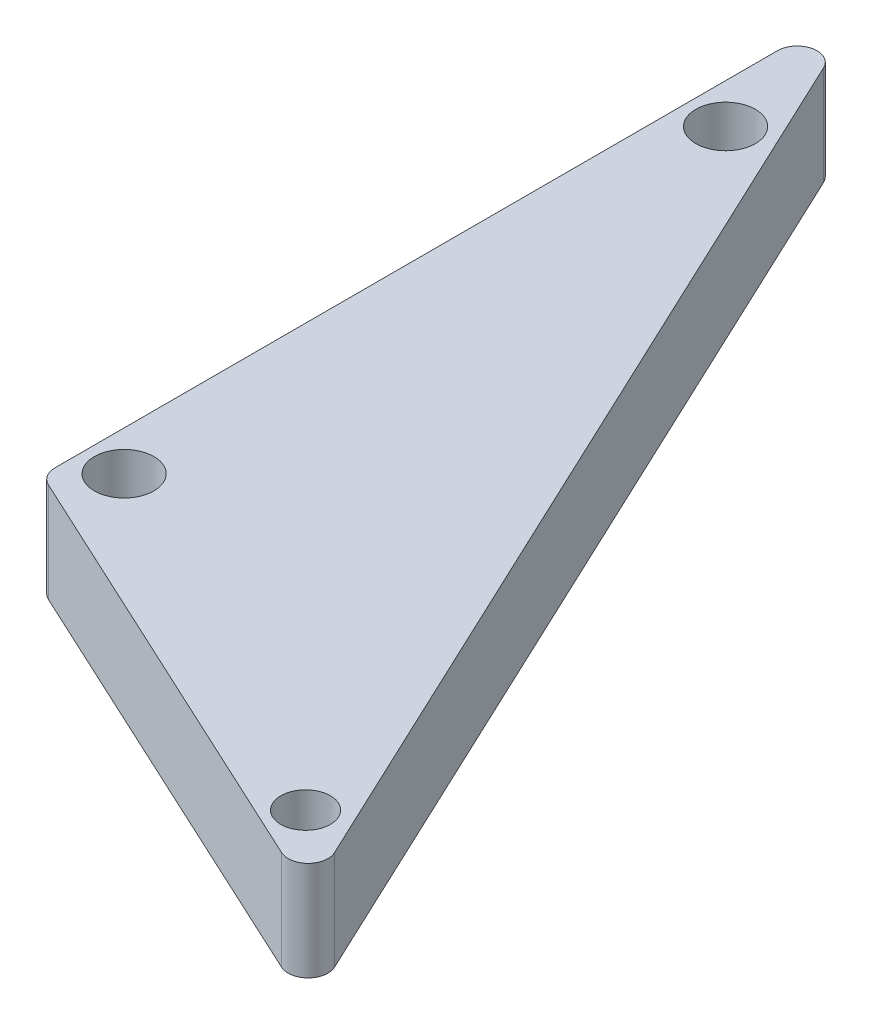
ISO-10303-21;
HEADER;
FILE_DESCRIPTION(('STEP AP214'),'2;1');
FILE_NAME('part.step','',(''),(''),'','','');
FILE_SCHEMA(('AUTOMOTIVE_DESIGN { 1 0 10303 214 1 1 1 1 }'));
ENDSEC;
DATA;
#1=APPLICATION_CONTEXT('core data for automotive mechanical design processes');
#2=APPLICATION_PROTOCOL_DEFINITION('international standard','automotive_design',2000,#1);
#3=PRODUCT_CONTEXT('',#1,'mechanical');
#4=PRODUCT('Part','Part','',(#3));
#5=PRODUCT_RELATED_PRODUCT_CATEGORY('part','',(#4));
#6=PRODUCT_DEFINITION_FORMATION('','',#4);
#7=PRODUCT_DEFINITION_CONTEXT('part definition',#1,'design');
#8=PRODUCT_DEFINITION('design','',#6,#7);
#9=PRODUCT_DEFINITION_SHAPE('','',#8);
#10=(LENGTH_UNIT() NAMED_UNIT(*) SI_UNIT(.MILLI.,.METRE.));
#11=(NAMED_UNIT(*) PLANE_ANGLE_UNIT() SI_UNIT($,.RADIAN.));
#12=(NAMED_UNIT(*) SI_UNIT($,.STERADIAN.) SOLID_ANGLE_UNIT());
#13=UNCERTAINTY_MEASURE_WITH_UNIT(LENGTH_MEASURE(1.E-05),#10,'distance_accuracy_value','');
#14=(GEOMETRIC_REPRESENTATION_CONTEXT(3) GLOBAL_UNCERTAINTY_ASSIGNED_CONTEXT((#13)) GLOBAL_UNIT_ASSIGNED_CONTEXT((#10,
#11,#12)) REPRESENTATION_CONTEXT('',''));
#15=CARTESIAN_POINT('',(0.,0.,0.));
#16=DIRECTION('',(0.,0.,1.));
#17=DIRECTION('',(1.,0.,0.));
#18=AXIS2_PLACEMENT_3D('',#15,#16,#17);
#19=CARTESIAN_POINT('',(63.5,12.7,29.464));
#20=DIRECTION('',(0.420898081621858,0.,-0.907107934529866));
#21=DIRECTION('',(-0.907107934529866,0.,-0.420898081621858));
#22=AXIS2_PLACEMENT_3D('',#19,#20,#21);
#23=PLANE('',#22);
#24=DIRECTION('',(0.907107934529866,0.,0.420898081621858));
#25=VECTOR('',#24,1.);
#26=CARTESIAN_POINT('',(63.5,12.7,29.464));
#27=LINE('',#26,#25);
#28=CARTESIAN_POINT('',(1.47091887268048,12.7,0.682506356923743));
#29=VERTEX_POINT('',#28);
#30=CARTESIAN_POINT('',(57.1519471420986,12.7,26.5185034739337));
#31=VERTEX_POINT('',#30);
#32=EDGE_CURVE('E105',#29,#31,#27,.T.);
#33=ORIENTED_EDGE('',*,*,#32,.F.);
#34=DIRECTION('',(0.,-1.,0.));
#35=VECTOR('',#34,1.);
#36=CARTESIAN_POINT('',(1.47091887268048,12.7,0.68250635692374));
#37=LINE('',#36,#35);
#38=CARTESIAN_POINT('',(1.47091887268048,0.,0.682506356923743));
#39=VERTEX_POINT('',#38);
#40=EDGE_CURVE('E91',#29,#39,#37,.T.);
#41=ORIENTED_EDGE('',*,*,#40,.T.);
#42=DIRECTION('',(0.907107934529866,0.,0.420898081621858));
#43=VECTOR('',#42,1.);
#44=CARTESIAN_POINT('',(63.5,0.,29.464));
#45=LINE('',#44,#43);
#46=CARTESIAN_POINT('',(57.1519471420986,0.,26.5185034739337));
#47=VERTEX_POINT('',#46);
#48=EDGE_CURVE('E103',#39,#47,#45,.T.);
#49=ORIENTED_EDGE('',*,*,#48,.T.);
#50=DIRECTION('',(0.,-1.,0.));
#51=VECTOR('',#50,1.);
#52=CARTESIAN_POINT('',(57.1519471420986,12.7,26.5185034739337));
#53=LINE('',#52,#51);
#54=EDGE_CURVE('E107',#47,#31,#53,.F.);
#55=ORIENTED_EDGE('',*,*,#54,.T.);
#56=EDGE_LOOP('',(#33,#41,#49,#55));
#57=FACE_BOUND('',#56,.T.);
#58=ADVANCED_FACE('F34',(#57),#23,.F.);
#59=CARTESIAN_POINT('',(0.,12.7,-105.41));
#60=DIRECTION('',(-0.904741459236604,0.,0.425961139000285));
#61=DIRECTION('',(0.425961139000285,0.,0.904741459236605));
#62=AXIS2_PLACEMENT_3D('',#59,#60,#61);
#63=PLANE('',#62);
#64=DIRECTION('',(-0.425961139000285,0.,-0.904741459236604));
#65=VECTOR('',#64,1.);
#66=CARTESIAN_POINT('',(0.,0.,-105.41));
#67=LINE('',#66,#65);
#68=CARTESIAN_POINT('',(60.5190715758791,0.,23.1325080271671));
#69=VERTEX_POINT('',#68);
#70=CARTESIAN_POINT('',(4.83804330646097,0.,-95.1339960170769));
#71=VERTEX_POINT('',#70);
#72=EDGE_CURVE('E111',#69,#71,#67,.T.);
#73=ORIENTED_EDGE('',*,*,#72,.T.);
#74=DIRECTION('',(0.,-1.,0.));
#75=VECTOR('',#74,1.);
#76=CARTESIAN_POINT('',(4.83804330646097,12.7,-95.1339960170769));
#77=LINE('',#76,#75);
#78=CARTESIAN_POINT('',(4.83804330646097,12.7,-95.1339960170769));
#79=VERTEX_POINT('',#78);
#80=EDGE_CURVE('E11',#71,#79,#77,.F.);
#81=ORIENTED_EDGE('',*,*,#80,.T.);
#82=DIRECTION('',(-0.425961139000285,0.,-0.904741459236604));
#83=VECTOR('',#82,1.);
#84=CARTESIAN_POINT('',(0.,12.7,-105.41));
#85=LINE('',#84,#83);
#86=CARTESIAN_POINT('',(60.5190715758791,12.7,23.1325080271671));
#87=VERTEX_POINT('',#86);
#88=EDGE_CURVE('E137',#87,#79,#85,.T.);
#89=ORIENTED_EDGE('',*,*,#88,.F.);
#90=DIRECTION('',(0.,-1.,0.));
#91=VECTOR('',#90,1.);
#92=CARTESIAN_POINT('',(60.5190715758791,12.7,23.1325080271671));
#93=LINE('',#92,#91);
#94=EDGE_CURVE('E42',#87,#69,#93,.T.);
#95=ORIENTED_EDGE('',*,*,#94,.T.);
#96=EDGE_LOOP('',(#73,#81,#89,#95));
#97=FACE_BOUND('',#96,.T.);
#98=ADVANCED_FACE('F136',(#97),#63,.F.);
#99=CARTESIAN_POINT('',(0.,12.7,0.));
#100=DIRECTION('',(1.,0.,0.));
#101=DIRECTION('',(0.,0.,-1.));
#102=AXIS2_PLACEMENT_3D('',#99,#100,#101);
#103=PLANE('',#102);
#104=DIRECTION('',(0.,0.,1.));
#105=VECTOR('',#104,1.);
#106=CARTESIAN_POINT('',(0.,0.,0.));
#107=LINE('',#106,#105);
#108=CARTESIAN_POINT('',(0.,0.,-94.0520547240162));
#109=VERTEX_POINT('',#108);
#110=CARTESIAN_POINT('',(0.,0.,-1.62154779678211));
#111=VERTEX_POINT('',#110);
#112=EDGE_CURVE('E114',#109,#111,#107,.T.);
#113=ORIENTED_EDGE('',*,*,#112,.T.);
#114=DIRECTION('',(0.,-1.,0.));
#115=VECTOR('',#114,1.);
#116=CARTESIAN_POINT('',(0.,12.7,-1.62154779678211));
#117=LINE('',#116,#115);
#118=CARTESIAN_POINT('',(0.,12.7,-1.62154779678211));
#119=VERTEX_POINT('',#118);
#120=EDGE_CURVE('E92',#111,#119,#117,.F.);
#121=ORIENTED_EDGE('',*,*,#120,.T.);
#122=DIRECTION('',(0.,0.,1.));
#123=VECTOR('',#122,1.);
#124=CARTESIAN_POINT('',(0.,12.7,0.));
#125=LINE('',#124,#123);
#126=CARTESIAN_POINT('',(0.,12.7,-94.0520547240162));
#127=VERTEX_POINT('',#126);
#128=EDGE_CURVE('E120',#127,#119,#125,.T.);
#129=ORIENTED_EDGE('',*,*,#128,.F.);
#130=DIRECTION('',(0.,-1.,0.));
#131=VECTOR('',#130,1.);
#132=CARTESIAN_POINT('',(0.,12.7,-94.0520547240162));
#133=LINE('',#132,#131);
#134=EDGE_CURVE('E97',#127,#109,#133,.T.);
#135=ORIENTED_EDGE('',*,*,#134,.T.);
#136=EDGE_LOOP('',(#113,#121,#129,#135));
#137=FACE_BOUND('',#136,.T.);
#138=ADVANCED_FACE('F145',(#137),#103,.F.);
#139=CARTESIAN_POINT('',(0.,12.7,0.));
#140=DIRECTION('',(0.,-1.,0.));
#141=DIRECTION('',(0.,0.,-1.));
#142=AXIS2_PLACEMENT_3D('',#139,#140,#141);
#143=PLANE('',#142);
#144=CARTESIAN_POINT('',(5.08,12.7,-82.3471964178995));
#145=DIRECTION('',(0.,-1.,0.));
#146=DIRECTION('',(0.,0.,-1.));
#147=AXIS2_PLACEMENT_3D('',#144,#145,#146);
#148=CIRCLE('',#147,3.81);
#149=CARTESIAN_POINT('',(5.08,12.7,-86.1571964178995));
#150=VERTEX_POINT('',#149);
#151=EDGE_CURVE('E112',#150,#150,#148,.T.);
#152=ORIENTED_EDGE('',*,*,#151,.T.);
#153=EDGE_LOOP('',(#152));
#154=FACE_BOUND('',#153,.T.);
#155=CARTESIAN_POINT('',(5.08,12.7,-5.39556681024185));
#156=DIRECTION('',(0.,-1.,0.));
#157=DIRECTION('',(0.,0.,-1.));
#158=AXIS2_PLACEMENT_3D('',#155,#156,#157);
#159=CIRCLE('',#158,3.81);
#160=CARTESIAN_POINT('',(5.08,12.7,-9.20556681024185));
#161=VERTEX_POINT('',#160);
#162=EDGE_CURVE('E158',#161,#161,#159,.T.);
#163=ORIENTED_EDGE('',*,*,#162,.T.);
#164=EDGE_LOOP('',(#163));
#165=FACE_BOUND('',#164,.T.);
#166=CARTESIAN_POINT('',(53.9556538892666,12.7,20.2615342416493));
#167=DIRECTION('',(0.,-1.,0.));
#168=DIRECTION('',(0.,0.,-1.));
#169=AXIS2_PLACEMENT_3D('',#166,#167,#168);
#170=CIRCLE('',#169,3.175);
#171=CARTESIAN_POINT('',(53.9556538892666,12.7,17.0865342416493));
#172=VERTEX_POINT('',#171);
#173=EDGE_CURVE('E152',#172,#172,#170,.T.);
#174=ORIENTED_EDGE('',*,*,#173,.T.);
#175=EDGE_LOOP('',(#174));
#176=FACE_BOUND('',#175,.T.);
#177=ORIENTED_EDGE('',*,*,#128,.T.);
#178=CARTESIAN_POINT('',(2.54000000000001,12.7,-1.62154779678211));
#179=DIRECTION('',(0.,-1.,0.));
#180=DIRECTION('',(0.,0.,-1.));
#181=AXIS2_PLACEMENT_3D('',#178,#179,#180);
#182=CIRCLE('',#181,2.54);
#183=EDGE_CURVE('E133',#119,#29,#182,.F.);
#184=ORIENTED_EDGE('',*,*,#183,.T.);
#185=ORIENTED_EDGE('',*,*,#32,.T.);
#186=CARTESIAN_POINT('',(58.2210282694181,12.7,24.2144493202279));
#187=DIRECTION('',(0.,-1.,0.));
#188=DIRECTION('',(0.,0.,-1.));
#189=AXIS2_PLACEMENT_3D('',#186,#187,#188);
#190=CIRCLE('',#189,2.54);
#191=EDGE_CURVE('E54',#31,#87,#190,.F.);
#192=ORIENTED_EDGE('',*,*,#191,.T.);
#193=ORIENTED_EDGE('',*,*,#88,.T.);
#194=CARTESIAN_POINT('',(2.54,12.7,-94.0520547240162));
#195=DIRECTION('',(0.,-1.,0.));
#196=DIRECTION('',(0.,0.,-1.));
#197=AXIS2_PLACEMENT_3D('',#194,#195,#196);
#198=CIRCLE('',#197,2.54);
#199=EDGE_CURVE('E131',#79,#127,#198,.F.);
#200=ORIENTED_EDGE('',*,*,#199,.T.);
#201=EDGE_LOOP('',(#177,#184,#185,#192,#193,#200));
#202=FACE_BOUND('',#201,.T.);
#203=ADVANCED_FACE('F169',(#154,#165,#176,#202),#143,.F.);
#204=CARTESIAN_POINT('',(0.,0.,0.));
#205=DIRECTION('',(0.,-1.,0.));
#206=DIRECTION('',(0.,0.,-1.));
#207=AXIS2_PLACEMENT_3D('',#204,#205,#206);
#208=PLANE('',#207);
#209=CARTESIAN_POINT('',(5.08,0.,-82.3471964178995));
#210=DIRECTION('',(0.,-1.,0.));
#211=DIRECTION('',(0.,0.,-1.));
#212=AXIS2_PLACEMENT_3D('',#209,#210,#211);
#213=CIRCLE('',#212,3.81);
#214=CARTESIAN_POINT('',(5.08,0.,-86.1571964178995));
#215=VERTEX_POINT('',#214);
#216=EDGE_CURVE('E117',#215,#215,#213,.T.);
#217=ORIENTED_EDGE('',*,*,#216,.F.);
#218=EDGE_LOOP('',(#217));
#219=FACE_BOUND('',#218,.T.);
#220=CARTESIAN_POINT('',(5.08,0.,-5.39556681024185));
#221=DIRECTION('',(0.,-1.,0.));
#222=DIRECTION('',(0.,0.,-1.));
#223=AXIS2_PLACEMENT_3D('',#220,#221,#222);
#224=CIRCLE('',#223,3.81);
#225=CARTESIAN_POINT('',(5.08,0.,-9.20556681024185));
#226=VERTEX_POINT('',#225);
#227=EDGE_CURVE('E155',#226,#226,#224,.T.);
#228=ORIENTED_EDGE('',*,*,#227,.F.);
#229=EDGE_LOOP('',(#228));
#230=FACE_BOUND('',#229,.T.);
#231=CARTESIAN_POINT('',(53.9556538892666,0.,20.2615342416493));
#232=DIRECTION('',(0.,-1.,0.));
#233=DIRECTION('',(0.,0.,-1.));
#234=AXIS2_PLACEMENT_3D('',#231,#232,#233);
#235=CIRCLE('',#234,3.175);
#236=CARTESIAN_POINT('',(53.9556538892666,0.,17.0865342416493));
#237=VERTEX_POINT('',#236);
#238=EDGE_CURVE('E149',#237,#237,#235,.T.);
#239=ORIENTED_EDGE('',*,*,#238,.F.);
#240=EDGE_LOOP('',(#239));
#241=FACE_BOUND('',#240,.T.);
#242=ORIENTED_EDGE('',*,*,#48,.F.);
#243=CARTESIAN_POINT('',(2.54000000000001,0.,-1.62154779678211));
#244=DIRECTION('',(0.,-1.,0.));
#245=DIRECTION('',(0.,0.,-1.));
#246=AXIS2_PLACEMENT_3D('',#243,#244,#245);
#247=CIRCLE('',#246,2.54);
#248=EDGE_CURVE('E87',#39,#111,#247,.T.);
#249=ORIENTED_EDGE('',*,*,#248,.T.);
#250=ORIENTED_EDGE('',*,*,#112,.F.);
#251=CARTESIAN_POINT('',(2.54,0.,-94.0520547240162));
#252=DIRECTION('',(0.,-1.,0.));
#253=DIRECTION('',(0.,0.,-1.));
#254=AXIS2_PLACEMENT_3D('',#251,#252,#253);
#255=CIRCLE('',#254,2.54);
#256=EDGE_CURVE('E98',#109,#71,#255,.T.);
#257=ORIENTED_EDGE('',*,*,#256,.T.);
#258=ORIENTED_EDGE('',*,*,#72,.F.);
#259=CARTESIAN_POINT('',(58.2210282694181,0.,24.2144493202279));
#260=DIRECTION('',(0.,-1.,0.));
#261=DIRECTION('',(0.,0.,-1.));
#262=AXIS2_PLACEMENT_3D('',#259,#260,#261);
#263=CIRCLE('',#262,2.54);
#264=EDGE_CURVE('E106',#69,#47,#263,.T.);
#265=ORIENTED_EDGE('',*,*,#264,.T.);
#266=EDGE_LOOP('',(#242,#249,#250,#257,#258,#265));
#267=FACE_BOUND('',#266,.T.);
#268=ADVANCED_FACE('F109',(#219,#230,#241,#267),#208,.T.);
#269=CARTESIAN_POINT('',(53.9556538892666,12.7,20.2615342416493));
#270=DIRECTION('',(0.,-1.,0.));
#271=DIRECTION('',(0.,0.,-1.));
#272=AXIS2_PLACEMENT_3D('',#269,#270,#271);
#273=CYLINDRICAL_SURFACE('',#272,3.175);
#274=ORIENTED_EDGE('',*,*,#173,.F.);
#275=EDGE_LOOP('',(#274));
#276=FACE_BOUND('',#275,.T.);
#277=ORIENTED_EDGE('',*,*,#238,.T.);
#278=EDGE_LOOP('',(#277));
#279=FACE_BOUND('',#278,.T.);
#280=ADVANCED_FACE('F168',(#276,#279),#273,.F.);
#281=CARTESIAN_POINT('',(5.08,12.7,-5.39556681024185));
#282=DIRECTION('',(0.,-1.,0.));
#283=DIRECTION('',(0.,0.,-1.));
#284=AXIS2_PLACEMENT_3D('',#281,#282,#283);
#285=CYLINDRICAL_SURFACE('',#284,3.81);
#286=ORIENTED_EDGE('',*,*,#162,.F.);
#287=EDGE_LOOP('',(#286));
#288=FACE_BOUND('',#287,.T.);
#289=ORIENTED_EDGE('',*,*,#227,.T.);
#290=EDGE_LOOP('',(#289));
#291=FACE_BOUND('',#290,.T.);
#292=ADVANCED_FACE('F176',(#288,#291),#285,.F.);
#293=CARTESIAN_POINT('',(5.08,12.7,-82.3471964178995));
#294=DIRECTION('',(0.,-1.,0.));
#295=DIRECTION('',(0.,0.,-1.));
#296=AXIS2_PLACEMENT_3D('',#293,#294,#295);
#297=CYLINDRICAL_SURFACE('',#296,3.81);
#298=ORIENTED_EDGE('',*,*,#151,.F.);
#299=EDGE_LOOP('',(#298));
#300=FACE_BOUND('',#299,.T.);
#301=ORIENTED_EDGE('',*,*,#216,.T.);
#302=EDGE_LOOP('',(#301));
#303=FACE_BOUND('',#302,.T.);
#304=ADVANCED_FACE('F164',(#300,#303),#297,.F.);
#305=CARTESIAN_POINT('',(2.54000000000001,12.7,-1.62154779678211));
#306=DIRECTION('',(0.,-1.,0.));
#307=DIRECTION('',(0.,0.,-1.));
#308=AXIS2_PLACEMENT_3D('',#305,#306,#307);
#309=CYLINDRICAL_SURFACE('',#308,2.54);
#310=ORIENTED_EDGE('',*,*,#183,.F.);
#311=ORIENTED_EDGE('',*,*,#120,.F.);
#312=ORIENTED_EDGE('',*,*,#248,.F.);
#313=ORIENTED_EDGE('',*,*,#40,.F.);
#314=EDGE_LOOP('',(#310,#311,#312,#313));
#315=FACE_BOUND('',#314,.T.);
#316=ADVANCED_FACE('F90',(#315),#309,.T.);
#317=CARTESIAN_POINT('',(2.54,12.7,-94.0520547240162));
#318=DIRECTION('',(0.,-1.,0.));
#319=DIRECTION('',(0.,0.,-1.));
#320=AXIS2_PLACEMENT_3D('',#317,#318,#319);
#321=CYLINDRICAL_SURFACE('',#320,2.54);
#322=ORIENTED_EDGE('',*,*,#199,.F.);
#323=ORIENTED_EDGE('',*,*,#80,.F.);
#324=ORIENTED_EDGE('',*,*,#256,.F.);
#325=ORIENTED_EDGE('',*,*,#134,.F.);
#326=EDGE_LOOP('',(#322,#323,#324,#325));
#327=FACE_BOUND('',#326,.T.);
#328=ADVANCED_FACE('F142',(#327),#321,.T.);
#329=CARTESIAN_POINT('',(58.2210282694181,12.7,24.2144493202279));
#330=DIRECTION('',(0.,-1.,0.));
#331=DIRECTION('',(0.,0.,-1.));
#332=AXIS2_PLACEMENT_3D('',#329,#330,#331);
#333=CYLINDRICAL_SURFACE('',#332,2.54);
#334=ORIENTED_EDGE('',*,*,#191,.F.);
#335=ORIENTED_EDGE('',*,*,#54,.F.);
#336=ORIENTED_EDGE('',*,*,#264,.F.);
#337=ORIENTED_EDGE('',*,*,#94,.F.);
#338=EDGE_LOOP('',(#334,#335,#336,#337));
#339=FACE_BOUND('',#338,.T.);
#340=ADVANCED_FACE('F36',(#339),#333,.T.);
#341=CLOSED_SHELL('',(#58,#98,#138,#203,#268,#280,#292,#304,#316,#328,#340));
#342=MANIFOLD_SOLID_BREP('B2',#341);
#343=ADVANCED_BREP_SHAPE_REPRESENTATION('',(#18,#342),#14);
#344=SHAPE_DEFINITION_REPRESENTATION(#9,#343);
ENDSEC;
END-ISO-10303-21;
